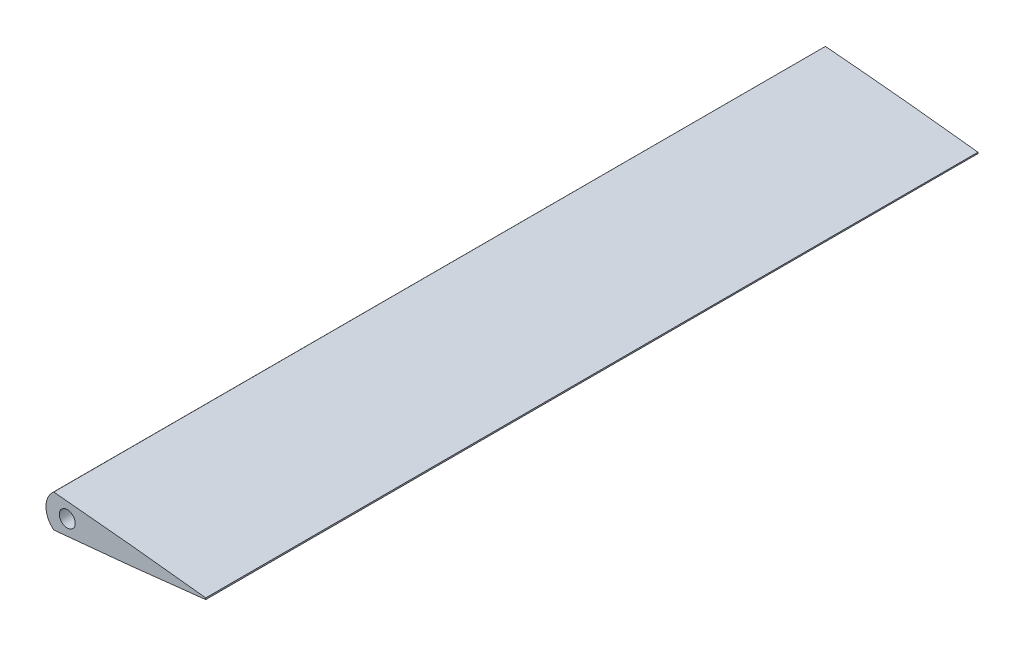
ISO-10303-21;
HEADER;
FILE_DESCRIPTION(('STEP AP214'),'2;1');
FILE_NAME('part.step','',(''),(''),'','','');
FILE_SCHEMA(('AUTOMOTIVE_DESIGN { 1 0 10303 214 1 1 1 1 }'));
ENDSEC;
DATA;
#1=APPLICATION_CONTEXT('core data for automotive mechanical design processes');
#2=APPLICATION_PROTOCOL_DEFINITION('international standard','automotive_design',2000,#1);
#3=PRODUCT_CONTEXT('',#1,'mechanical');
#4=PRODUCT('Part','Part','',(#3));
#5=PRODUCT_RELATED_PRODUCT_CATEGORY('part','',(#4));
#6=PRODUCT_DEFINITION_FORMATION('','',#4);
#7=PRODUCT_DEFINITION_CONTEXT('part definition',#1,'design');
#8=PRODUCT_DEFINITION('design','',#6,#7);
#9=PRODUCT_DEFINITION_SHAPE('','',#8);
#10=(LENGTH_UNIT() NAMED_UNIT(*) SI_UNIT(.MILLI.,.METRE.));
#11=(NAMED_UNIT(*) PLANE_ANGLE_UNIT() SI_UNIT($,.RADIAN.));
#12=(NAMED_UNIT(*) SI_UNIT($,.STERADIAN.) SOLID_ANGLE_UNIT());
#13=UNCERTAINTY_MEASURE_WITH_UNIT(LENGTH_MEASURE(1.E-05),#10,'distance_accuracy_value','');
#14=(GEOMETRIC_REPRESENTATION_CONTEXT(3) GLOBAL_UNCERTAINTY_ASSIGNED_CONTEXT((#13)) GLOBAL_UNIT_ASSIGNED_CONTEXT((#10,
#11,#12)) REPRESENTATION_CONTEXT('',''));
#15=CARTESIAN_POINT('',(0.,0.,0.));
#16=DIRECTION('',(0.,0.,1.));
#17=DIRECTION('',(1.,0.,0.));
#18=AXIS2_PLACEMENT_3D('',#15,#16,#17);
#19=CARTESIAN_POINT('',(70.,0.0735,0.));
#20=CARTESIAN_POINT('',(70.,0.05775,-90.));
#21=CARTESIAN_POINT('',(68.8335080399569,0.207369644620947,0.));
#22=CARTESIAN_POINT('',(69.0834706028233,0.162933292202173,-90.));
#23=CARTESIAN_POINT('',(66.5013366610328,0.475015684530368,0.));
#24=CARTESIAN_POINT('',(67.2510502336686,0.373226609273861,-90.));
#25=CARTESIAN_POINT('',(59.5068534375464,1.22059950301267,0.));
#26=CARTESIAN_POINT('',(61.7553848437865,0.959042466652812,-90.));
#27=CARTESIAN_POINT('',(51.3411291423464,1.97323482674955,0.));
#28=CARTESIAN_POINT('',(55.3394586118436,1.55039879244607,-90.));
#29=CARTESIAN_POINT('',(42.0033550763474,2.6781420115594,0.));
#30=CARTESIAN_POINT('',(48.0026361314158,2.10425443765382,-90.));
#31=CARTESIAN_POINT('',(35.0033276822841,3.10894088739879,0.));
#32=CARTESIAN_POINT('',(42.5026146075089,2.44273926867048,-90.));
#33=CARTESIAN_POINT('',(28.0028425035665,3.41546324526182,0.));
#34=CARTESIAN_POINT('',(37.0022333956594,2.68357826413429,-90.));
#35=CARTESIAN_POINT('',(20.9996176811236,3.54412790887703,0.));
#36=CARTESIAN_POINT('',(31.4996996065971,2.78467192840338,-90.));
#37=CARTESIAN_POINT('',(15.1621219043051,3.43896686269696,0.));
#38=CARTESIAN_POINT('',(26.913095781954,2.70204539211904,-90.));
#39=CARTESIAN_POINT('',(10.4932470006794,3.14283251784594,0.));
#40=CARTESIAN_POINT('',(23.2446940719624,2.46936840687895,-90.));
#41=CARTESIAN_POINT('',(7.57533938887657,2.83324720582861,0.));
#42=CARTESIAN_POINT('',(20.9520523769744,2.22612280457962,-90.));
#43=CARTESIAN_POINT('',(5.24030650692798,2.46209864989354,0.));
#44=CARTESIAN_POINT('',(19.1173836840148,1.93450608205921,-90.));
#45=CARTESIAN_POINT('',(3.48530508189471,2.09967851116287,0.));
#46=CARTESIAN_POINT('',(17.7384539929173,1.64974740162797,-90.));
#47=CARTESIAN_POINT('',(1.99314144537641,1.63920813156458,0.));
#48=CARTESIAN_POINT('',(16.5660397070815,1.28794924622931,-90.));
#49=CARTESIAN_POINT('',(0.755632776345661,1.11827318057108,0.));
#50=CARTESIAN_POINT('',(15.5937114671287,0.878643213305847,-90.));
#51=CARTESIAN_POINT('',(-0.447448608869755,0.,0.));
#52=CARTESIAN_POINT('',(14.648433235888,0.,-90.));
#53=CARTESIAN_POINT('',(0.755632776345677,-1.11827318057109,0.));
#54=CARTESIAN_POINT('',(15.5937114671287,-0.878643213305856,-90.));
#55=CARTESIAN_POINT('',(1.99314144537639,-1.63920813156457,0.));
#56=CARTESIAN_POINT('',(16.5660397070814,-1.2879492462293,-90.));
#57=CARTESIAN_POINT('',(3.48530508189473,-2.09967851116288,0.));
#58=CARTESIAN_POINT('',(17.7384539929173,-1.64974740162797,-90.));
#59=CARTESIAN_POINT('',(5.24030650692796,-2.46209864989353,0.));
#60=CARTESIAN_POINT('',(19.1173836840148,-1.93450608205921,-90.));
#61=CARTESIAN_POINT('',(7.57533938887658,-2.83324720582861,0.));
#62=CARTESIAN_POINT('',(20.9520523769745,-2.22612280457962,-90.));
#63=CARTESIAN_POINT('',(10.4932470006794,-3.14283251784594,0.));
#64=CARTESIAN_POINT('',(23.2446940719624,-2.46936840687895,-90.));
#65=CARTESIAN_POINT('',(15.1621219043051,-3.43896686269696,0.));
#66=CARTESIAN_POINT('',(26.913095781954,-2.70204539211904,-90.));
#67=CARTESIAN_POINT('',(20.9996176811236,-3.54412790887703,0.));
#68=CARTESIAN_POINT('',(31.4996996065971,-2.78467192840338,-90.));
#69=CARTESIAN_POINT('',(28.0028425035665,-3.41546324526182,0.));
#70=CARTESIAN_POINT('',(37.0022333956594,-2.68357826413429,-90.));
#71=CARTESIAN_POINT('',(35.0033276822841,-3.10894088739879,0.));
#72=CARTESIAN_POINT('',(42.5026146075089,-2.44273926867048,-90.));
#73=CARTESIAN_POINT('',(42.0033550763474,-2.6781420115594,0.));
#74=CARTESIAN_POINT('',(48.0026361314158,-2.10425443765382,-90.));
#75=CARTESIAN_POINT('',(51.3411291423464,-1.97323482674955,0.));
#76=CARTESIAN_POINT('',(55.3394586118436,-1.55039879244607,-90.));
#77=CARTESIAN_POINT('',(59.5068534375464,-1.22059950301267,0.));
#78=CARTESIAN_POINT('',(61.7553848437864,-0.959042466652813,-90.));
#79=CARTESIAN_POINT('',(66.5013366610328,-0.475015684530368,0.));
#80=CARTESIAN_POINT('',(67.2510502336687,-0.37322660927386,-90.));
#81=CARTESIAN_POINT('',(68.8335080399569,-0.207369644620947,0.));
#82=CARTESIAN_POINT('',(69.0834706028233,-0.162933292202173,-90.));
#83=CARTESIAN_POINT('',(70.,-0.0735,0.));
#84=CARTESIAN_POINT('',(70.,-0.05775,-90.));
#85=B_SPLINE_SURFACE_WITH_KNOTS('',3,1,((#19,#20),(#21,#22),(#23,#24),(#25,#26),(#27,#28),(#29,
#30),(#31,#32),(#33,#34),(#35,#36),(#37,#38),(#39,#40),(#41,#42),(#43,#44),(#45,#46),(#47,#48),
(#49,#50),(#51,#52),(#53,#54),(#55,#56),(#57,#58),(#59,#60),(#61,#62),(#63,#64),(#65,#66),(#67,
#68),(#69,#70),(#71,#72),(#73,#74),(#75,#76),(#77,#78),(#79,#80),(#81,#82),(#83,#84)),
.UNSPECIFIED.,.F.,.F.,.F.,(4,1,1,1,1,1,1,1,1,1,1,1,1,1,1,1,1,1,1,1,1,1,1,1,1,1,1,1,1,1,4),(2,2),
(0.,0.0248235560251693,0.0496298207515118,0.148712652883516,0.198182139774084,0.247604472837194,
0.296979942928689,0.34631759583347,0.395664019787251,0.420382181676291,0.445198050680487,
0.457689209223658,0.470304282792856,0.483229229601925,0.4900691736526,0.5,0.5099308263474,
0.516770770398075,0.529695717207144,0.542310790776342,0.554801949319513,0.579617818323709,
0.604335980212749,0.65368240416653,0.703020057071311,0.752395527162806,0.801817860225916,
0.851287347116484,0.950370179248488,0.975176443974831,1.),(0.,1.),.UNSPECIFIED.);
#86=CARTESIAN_POINT('',(70.,0.0704375,-17.5));
#87=CARTESIAN_POINT('',(69.7414668779824,0.100106949896239,-17.5));
#88=CARTESIAN_POINT('',(69.4829337921183,0.129777118919202,-17.5));
#89=CARTESIAN_POINT('',(68.9658544651581,0.189005899479906,-17.5));
#90=CARTESIAN_POINT('',(68.7073082240433,0.218564510853554,-17.5));
#91=CARTESIAN_POINT('',(68.1901882358893,0.277457306950232,-17.5));
#92=CARTESIAN_POINT('',(67.9316144886635,0.306791490036966,-17.5));
#93=CARTESIAN_POINT('',(67.4144299873231,0.365130673882984,-17.5));
#94=CARTESIAN_POINT('',(67.1558192332321,0.3941356748506,-17.5));
#95=CARTESIAN_POINT('',(66.4168039808516,0.476344441079446,-17.5));
#96=CARTESIAN_POINT('',(65.9363355626864,0.528974992491431,-17.5));
#97=CARTESIAN_POINT('',(64.9752343472049,0.632715956153438,-17.5));
#98=CARTESIAN_POINT('',(64.494601549673,0.683826366402973,-17.5));
#99=CARTESIAN_POINT('',(63.5332009263706,0.784783191340418,-17.5));
#100=CARTESIAN_POINT('',(63.0524330999367,0.834629599705253,-17.5));
#101=CARTESIAN_POINT('',(62.0907783018258,0.933156407462658,-17.5));
#102=CARTESIAN_POINT('',(61.6098913302001,0.981836807356616,-17.5));
#103=CARTESIAN_POINT('',(60.1670563707481,1.12610930993913,-17.5));
#104=CARTESIAN_POINT('',(59.2049310287071,1.21993306286322,-17.5));
#105=CARTESIAN_POINT('',(57.2802402048466,1.40290932818104,-17.5));
#106=CARTESIAN_POINT('',(56.3176747249078,1.49206186035103,-17.5));
#107=CARTESIAN_POINT('',(55.2366038504029,1.5895615724776,-17.5));
#108=CARTESIAN_POINT('',(55.1183034836896,1.60019551925266,-17.5));
#109=CARTESIAN_POINT('',(55.,1.6107944379007,-17.5));
#110=B_SPLINE_CURVE_WITH_KNOTS('',3,(#86,#87,#88,#89,#90,#91,#92,#93,#94,#95,#96,#97,#98,#99,
#100,#101,#102,#103,#104,#105,#106,#107,#108,#109),.UNSPECIFIED.,.F.,.F.,(4,2,2,2,2,2,2,2,2,2,2,
4),(0.,0.780690069571208,1.56138128703616,2.34207819107562,3.12277460100202,4.57279884031261,
6.02282498775331,7.47285838741103,8.92289116353951,11.8229467324595,14.7229900226021,
15.0793220328914),.UNSPECIFIED.);
#111=CARTESIAN_POINT('',(70.,0.0704375,-17.5));
#112=VERTEX_POINT('',#111);
#113=CARTESIAN_POINT('',(55.7299128466162,1.54495262801463,-17.5));
#114=VERTEX_POINT('',#113);
#115=EDGE_CURVE('E99',#112,#114,#110,.T.);
#116=DIRECTION('',(0.,-0.000174999997320312,-0.9999999846875));
#117=VECTOR('',#116,1.);
#118=CARTESIAN_POINT('',(70.,0.065625,-45.));
#119=LINE('',#118,#117);
#120=CARTESIAN_POINT('',(70.,0.0577500000000001,-90.));
#121=VERTEX_POINT('',#120);
#122=EDGE_CURVE('E268',#112,#121,#119,.T.);
#123=CARTESIAN_POINT('',(70.,0.05775,-90.));
#124=CARTESIAN_POINT('',(69.0834706028233,0.162933292202173,-90.));
#125=CARTESIAN_POINT('',(67.2510502336686,0.373226609273861,-90.));
#126=CARTESIAN_POINT('',(61.7553848437865,0.959042466652812,-90.));
#127=CARTESIAN_POINT('',(55.3394586118436,1.55039879244607,-90.));
#128=CARTESIAN_POINT('',(48.0026361314158,2.10425443765382,-90.));
#129=CARTESIAN_POINT('',(42.5026146075089,2.44273926867048,-90.));
#130=CARTESIAN_POINT('',(37.0022333956594,2.68357826413429,-90.));
#131=CARTESIAN_POINT('',(31.4996996065971,2.78467192840338,-90.));
#132=CARTESIAN_POINT('',(26.913095781954,2.70204539211904,-90.));
#133=CARTESIAN_POINT('',(23.2446940719624,2.46936840687895,-90.));
#134=CARTESIAN_POINT('',(20.9520523769744,2.22612280457962,-90.));
#135=CARTESIAN_POINT('',(19.1173836840148,1.93450608205921,-90.));
#136=CARTESIAN_POINT('',(17.7384539929173,1.64974740162797,-90.));
#137=CARTESIAN_POINT('',(16.5660397070815,1.28794924622931,-90.));
#138=CARTESIAN_POINT('',(15.5937114671287,0.878643213305847,-90.));
#139=CARTESIAN_POINT('',(14.648433235888,0.,-90.));
#140=CARTESIAN_POINT('',(15.5937114671287,-0.878643213305856,-90.));
#141=CARTESIAN_POINT('',(16.5660397070814,-1.2879492462293,-90.));
#142=CARTESIAN_POINT('',(17.7384539929173,-1.64974740162797,-90.));
#143=CARTESIAN_POINT('',(19.1173836840148,-1.93450608205921,-90.));
#144=CARTESIAN_POINT('',(20.9520523769745,-2.22612280457962,-90.));
#145=CARTESIAN_POINT('',(23.2446940719624,-2.46936840687895,-90.));
#146=CARTESIAN_POINT('',(26.913095781954,-2.70204539211904,-90.));
#147=CARTESIAN_POINT('',(31.4996996065971,-2.78467192840338,-90.));
#148=CARTESIAN_POINT('',(37.0022333956594,-2.68357826413429,-90.));
#149=CARTESIAN_POINT('',(42.5026146075089,-2.44273926867048,-90.));
#150=CARTESIAN_POINT('',(48.0026361314158,-2.10425443765382,-90.));
#151=CARTESIAN_POINT('',(55.3394586118436,-1.55039879244607,-90.));
#152=CARTESIAN_POINT('',(61.7553848437864,-0.959042466652813,-90.));
#153=CARTESIAN_POINT('',(67.2510502336687,-0.37322660927386,-90.));
#154=CARTESIAN_POINT('',(69.0834706028233,-0.162933292202173,-90.));
#155=CARTESIAN_POINT('',(70.,-0.05775,-90.));
#156=B_SPLINE_CURVE_WITH_KNOTS('',3,(#123,#124,#125,#126,#127,#128,#129,#130,#131,#132,#133,
#134,#135,#136,#137,#138,#139,#140,#141,#142,#143,#144,#145,#146,#147,#148,#149,#150,#151,#152,
#153,#154,#155),.UNSPECIFIED.,.F.,.F.,(4,1,1,1,1,1,1,1,1,1,1,1,1,1,1,1,1,1,1,1,1,1,1,1,1,1,1,1,
1,1,4),(0.,0.0248235560251693,0.0496298207515118,0.148712652883516,0.198182139774084,
0.247604472837194,0.296979942928689,0.34631759583347,0.395664019787251,0.420382181676291,
0.445198050680487,0.457689209223658,0.470304282792856,0.483229229601925,0.4900691736526,0.5,
0.5099308263474,0.516770770398075,0.529695717207144,0.542310790776342,0.554801949319513,
0.579617818323709,0.604335980212749,0.65368240416653,0.703020057071311,0.752395527162806,
0.801817860225916,0.851287347116484,0.950370179248488,0.975176443974831,1.),.UNSPECIFIED.);
#157=CARTESIAN_POINT('',(55.674911850337,1.49804585898522,-90.));
#158=VERTEX_POINT('',#157);
#159=EDGE_CURVE('E271',#121,#158,#156,.T.);
#160=CARTESIAN_POINT('',(55.7299128466161,1.54495262801455,-17.5));
#161=CARTESIAN_POINT('',(55.7292076001844,1.54437285208487,-18.5409232678505));
#162=CARTESIAN_POINT('',(55.728499327807,1.54378978121006,-19.5818465318398));
#163=CARTESIAN_POINT('',(55.7249424860675,1.54085753517065,-24.7864628324153));
#164=CARTESIAN_POINT('',(55.7220474771504,1.5384576850111,-28.9501558089452));
#165=CARTESIAN_POINT('',(55.713200399108,1.53107996407553,-41.4412345246901));
#166=CARTESIAN_POINT('',(55.7070862786955,1.52592392284566,-49.7686200443526));
#167=CARTESIAN_POINT('',(55.6925752374118,1.51352429525124,-68.7299887066044));
#168=CARTESIAN_POINT('',(55.6840150995807,1.50609806871139,-79.3639716101941));
#169=CARTESIAN_POINT('',(55.6749130180213,1.49804689185324,-89.9986357121884));
#170=CARTESIAN_POINT('',(55.6749124341803,1.49804637542052,-89.9993178560942));
#171=CARTESIAN_POINT('',(55.674911850337,1.49804585898522,-90.));
#172=B_SPLINE_CURVE_WITH_KNOTS('',3,(#160,#161,#162,#163,#164,#165,#166,#167,#168,#169,#170,
#171),.UNSPECIFIED.,.F.,.F.,(4,2,2,2,2,4),(0.,3.12277100471986,15.6138550255425,40.596023084312,
72.4979897857242,72.5000362187775),.UNSPECIFIED.);
#173=EDGE_CURVE('E86',#114,#158,#172,.T.);
#174=ORIENTED_EDGE('',*,*,#115,.F.);
#175=ORIENTED_EDGE('',*,*,#122,.T.);
#176=ORIENTED_EDGE('',*,*,#159,.T.);
#177=ORIENTED_EDGE('',*,*,#173,.F.);
#178=EDGE_LOOP('',(#174,#175,#176,#177));
#179=FACE_BOUND('',#178,.T.);
#180=ADVANCED_FACE('F39',(#179),#85,.F.);
#181=CARTESIAN_POINT('',(70.,0.05775,-90.));
#182=CARTESIAN_POINT('',(69.0834706028233,0.162933292202173,-90.));
#183=CARTESIAN_POINT('',(67.2510502336686,0.373226609273861,-90.));
#184=CARTESIAN_POINT('',(61.7553848437865,0.959042466652812,-90.));
#185=CARTESIAN_POINT('',(55.3394586118436,1.55039879244607,-90.));
#186=CARTESIAN_POINT('',(48.0026361314158,2.10425443765382,-90.));
#187=CARTESIAN_POINT('',(42.5026146075089,2.44273926867048,-90.));
#188=CARTESIAN_POINT('',(37.0022333956594,2.68357826413429,-90.));
#189=CARTESIAN_POINT('',(31.4996996065971,2.78467192840338,-90.));
#190=CARTESIAN_POINT('',(26.913095781954,2.70204539211904,-90.));
#191=CARTESIAN_POINT('',(23.2446940719624,2.46936840687895,-90.));
#192=CARTESIAN_POINT('',(20.9520523769744,2.22612280457962,-90.));
#193=CARTESIAN_POINT('',(19.1173836840148,1.93450608205921,-90.));
#194=CARTESIAN_POINT('',(17.7384539929173,1.64974740162797,-90.));
#195=CARTESIAN_POINT('',(16.5660397070815,1.28794924622931,-90.));
#196=CARTESIAN_POINT('',(15.5937114671287,0.878643213305847,-90.));
#197=CARTESIAN_POINT('',(14.648433235888,0.,-90.));
#198=CARTESIAN_POINT('',(15.5937114671287,-0.878643213305856,-90.));
#199=CARTESIAN_POINT('',(16.5660397070814,-1.2879492462293,-90.));
#200=CARTESIAN_POINT('',(17.7384539929173,-1.64974740162797,-90.));
#201=CARTESIAN_POINT('',(19.1173836840148,-1.93450608205921,-90.));
#202=CARTESIAN_POINT('',(20.9520523769745,-2.22612280457962,-90.));
#203=CARTESIAN_POINT('',(23.2446940719624,-2.46936840687895,-90.));
#204=CARTESIAN_POINT('',(26.913095781954,-2.70204539211904,-90.));
#205=CARTESIAN_POINT('',(31.4996996065971,-2.78467192840338,-90.));
#206=CARTESIAN_POINT('',(37.0022333956594,-2.68357826413429,-90.));
#207=CARTESIAN_POINT('',(42.5026146075089,-2.44273926867048,-90.));
#208=CARTESIAN_POINT('',(48.0026361314158,-2.10425443765382,-90.));
#209=CARTESIAN_POINT('',(55.3394586118436,-1.55039879244607,-90.));
#210=CARTESIAN_POINT('',(61.7553848437864,-0.959042466652813,-90.));
#211=CARTESIAN_POINT('',(67.2510502336687,-0.37322660927386,-90.));
#212=CARTESIAN_POINT('',(69.0834706028233,-0.162933292202173,-90.));
#213=CARTESIAN_POINT('',(70.,-0.05775,-90.));
#214=B_SPLINE_CURVE_WITH_KNOTS('',3,(#181,#182,#183,#184,#185,#186,#187,#188,#189,#190,#191,
#192,#193,#194,#195,#196,#197,#198,#199,#200,#201,#202,#203,#204,#205,#206,#207,#208,#209,#210,
#211,#212,#213),.UNSPECIFIED.,.F.,.F.,(4,1,1,1,1,1,1,1,1,1,1,1,1,1,1,1,1,1,1,1,1,1,1,1,1,1,1,1,
1,1,4),(0.,0.0248235560251693,0.0496298207515118,0.148712652883516,0.198182139774084,
0.247604472837194,0.296979942928689,0.34631759583347,0.395664019787251,0.420382181676291,
0.445198050680487,0.457689209223658,0.470304282792856,0.483229229601925,0.4900691736526,0.5,
0.5099308263474,0.516770770398075,0.529695717207144,0.542310790776342,0.554801949319513,
0.579617818323709,0.604335980212749,0.65368240416653,0.703020057071311,0.752395527162806,
0.801817860225916,0.851287347116484,0.950370179248488,0.975176443974831,1.),.UNSPECIFIED.);
#215=CARTESIAN_POINT('',(70.,-0.0577500000000001,-90.));
#216=VERTEX_POINT('',#215);
#217=CARTESIAN_POINT('',(55.674911850337,-1.49804585898522,-90.));
#218=VERTEX_POINT('',#217);
#219=EDGE_CURVE('E94',#216,#218,#214,.F.);
#220=DIRECTION('',(0.,0.000174999997320312,-0.9999999846875));
#221=VECTOR('',#220,1.);
#222=CARTESIAN_POINT('',(70.,-0.065625,-45.));
#223=LINE('',#222,#221);
#224=CARTESIAN_POINT('',(70.,-0.0704375,-17.5));
#225=VERTEX_POINT('',#224);
#226=EDGE_CURVE('E267',#225,#216,#223,.T.);
#227=CARTESIAN_POINT('',(55.,-1.6107944379007,-17.5));
#228=CARTESIAN_POINT('',(55.5183924773578,-1.56435100588624,-17.5));
#229=CARTESIAN_POINT('',(56.0367247671315,-1.51723546076364,-17.5));
#230=CARTESIAN_POINT('',(57.07325571094,-1.42165572140086,-17.5));
#231=CARTESIAN_POINT('',(57.5914543671824,-1.37319155110175,-17.5));
#232=CARTESIAN_POINT('',(58.605535087078,-1.27701288064262,-17.5));
#233=CARTESIAN_POINT('',(59.1014225357748,-1.22935515154006,-17.5));
#234=CARTESIAN_POINT('',(60.0930766492884,-1.13279581211134,-17.5));
#235=CARTESIAN_POINT('',(60.5888433140275,-1.08389420098766,-17.5));
#236=CARTESIAN_POINT('',(61.580251814176,-0.984836506136815,-17.5));
#237=CARTESIAN_POINT('',(62.0758936494551,-0.934680421107013,-17.5));
#238=CARTESIAN_POINT('',(63.0670504176442,-0.833132978354628,-17.5));
#239=CARTESIAN_POINT('',(63.5625653506397,-0.781741621467571,-17.5));
#240=CARTESIAN_POINT('',(64.5534861774625,-0.677597789115176,-17.5));
#241=CARTESIAN_POINT('',(65.0488920617085,-0.624845222290212,-17.5));
#242=CARTESIAN_POINT('',(65.7918713913089,-0.54451705246844,-17.5));
#243=CARTESIAN_POINT('',(66.0395097294562,-0.517541093179054,-17.5));
#244=CARTESIAN_POINT('',(66.5347381649614,-0.463149945752336,-17.5));
#245=CARTESIAN_POINT('',(66.7823282623273,-0.435734757688022,-17.5));
#246=CARTESIAN_POINT('',(67.5250324576231,-0.35289255001225,-17.5));
#247=CARTESIAN_POINT('',(68.0200798203222,-0.296868956053062,-17.5));
#248=CARTESIAN_POINT('',(69.0100848098036,-0.184038659458192,-17.5));
#249=CARTESIAN_POINT('',(69.5050424367104,-0.127231957917589,-17.5));
#250=CARTESIAN_POINT('',(70.,-0.0704375,-17.5));
#251=B_SPLINE_CURVE_WITH_KNOTS('',3,(#227,#228,#229,#230,#231,#232,#233,#234,#235,#236,#237,
#238,#239,#240,#241,#242,#243,#244,#245,#246,#247,#248,#249,#250),.UNSPECIFIED.,.F.,.F.,(4,2,2,
2,2,2,2,2,2,2,2,4),(0.,1.56140595532902,3.12278420990647,4.61729950187834,6.11181575210937,
7.60633355430464,9.10085034565005,10.5954677059592,11.3427772579192,12.090086685649,
13.5847074675807,15.0793261596803),.UNSPECIFIED.);
#252=CARTESIAN_POINT('',(55.7299128466161,-1.54495262801456,-17.5));
#253=VERTEX_POINT('',#252);
#254=EDGE_CURVE('E95',#253,#225,#251,.T.);
#255=CARTESIAN_POINT('',(55.674911850337,-1.49804585898522,-90.));
#256=CARTESIAN_POINT('',(55.6758027739737,-1.49883392162366,-88.9590770113374));
#257=CARTESIAN_POINT('',(55.6766884725097,-1.49961594560514,-87.9181540136105));
#258=CARTESIAN_POINT('',(55.6810914816451,-1.5034967060943,-82.7135389797662));
#259=CARTESIAN_POINT('',(55.6845323416069,-1.50650736434355,-78.5498468128421));
#260=CARTESIAN_POINT('',(55.6946349306293,-1.51528950909782,-66.0587699524832));
#261=CARTESIAN_POINT('',(55.7010766688208,-1.52081116560385,-57.7313849064818));
#262=CARTESIAN_POINT('',(55.7151864063618,-1.53276169088771,-38.7693335072415));
#263=CARTESIAN_POINT('',(55.7226996445648,-1.53901803255006,-28.134666928311));
#264=CARTESIAN_POINT('',(55.7299128466161,-1.54495262801455,-17.5));
#265=B_SPLINE_CURVE_WITH_KNOTS('',3,(#255,#256,#257,#258,#259,#260,#261,#262,#263,#264),
.UNSPECIFIED.,.F.,.F.,(4,2,2,2,4),(0.,3.12277100478067,15.613855028726,40.5960230976778,
72.5000362274556),.UNSPECIFIED.);
#266=EDGE_CURVE('E83',#218,#253,#265,.T.);
#267=ORIENTED_EDGE('',*,*,#219,.F.);
#268=ORIENTED_EDGE('',*,*,#226,.F.);
#269=ORIENTED_EDGE('',*,*,#254,.F.);
#270=ORIENTED_EDGE('',*,*,#266,.F.);
#271=EDGE_LOOP('',(#267,#268,#269,#270));
#272=FACE_BOUND('',#271,.T.);
#273=ADVANCED_FACE('F92',(#272),#85,.F.);
#274=CARTESIAN_POINT('',(55.,-4.68748352412842,-90.));
#275=DIRECTION('',(0.,0.,-1.));
#276=DIRECTION('',(1.,0.,0.));
#277=AXIS2_PLACEMENT_3D('',#274,#275,#276);
#278=PLANE('',#277);
#279=CARTESIAN_POINT('',(57.,0.,-90.));
#280=DIRECTION('',(0.,0.,1.));
#281=DIRECTION('',(1.,0.,0.));
#282=AXIS2_PLACEMENT_3D('',#279,#280,#281);
#283=CIRCLE('',#282,0.749999999999999);
#284=CARTESIAN_POINT('',(57.75,0.,-90.));
#285=VERTEX_POINT('',#284);
#286=EDGE_CURVE('E168',#285,#285,#283,.T.);
#287=ORIENTED_EDGE('',*,*,#286,.T.);
#288=EDGE_LOOP('',(#287));
#289=FACE_BOUND('',#288,.T.);
#290=ORIENTED_EDGE('',*,*,#159,.F.);
#291=DIRECTION('',(0.,1.,0.));
#292=VECTOR('',#291,1.);
#293=CARTESIAN_POINT('',(70.,-3.54412790887703,-90.));
#294=LINE('',#293,#292);
#295=EDGE_CURVE('E54',#216,#121,#294,.T.);
#296=ORIENTED_EDGE('',*,*,#295,.F.);
#297=ORIENTED_EDGE('',*,*,#219,.T.);
#298=CARTESIAN_POINT('',(57.,0.,-90.));
#299=DIRECTION('',(0.,0.,-1.));
#300=DIRECTION('',(1.,0.,0.));
#301=AXIS2_PLACEMENT_3D('',#298,#299,#300);
#302=CIRCLE('',#301,2.);
#303=EDGE_CURVE('E80',#218,#158,#302,.T.);
#304=ORIENTED_EDGE('',*,*,#303,.T.);
#305=EDGE_LOOP('',(#290,#296,#297,#304));
#306=FACE_BOUND('',#305,.T.);
#307=ADVANCED_FACE('F97',(#289,#306),#278,.T.);
#308=CARTESIAN_POINT('',(55.,-4.68748352412842,-17.5));
#309=DIRECTION('',(0.,0.,1.));
#310=DIRECTION('',(-1.,0.,0.));
#311=AXIS2_PLACEMENT_3D('',#308,#309,#310);
#312=PLANE('',#311);
#313=CARTESIAN_POINT('',(57.,0.,-17.5));
#314=DIRECTION('',(0.,0.,-1.));
#315=DIRECTION('',(-1.,0.,0.));
#316=AXIS2_PLACEMENT_3D('',#313,#314,#315);
#317=CIRCLE('',#316,0.749999999999999);
#318=CARTESIAN_POINT('',(56.25,0.,-17.5));
#319=VERTEX_POINT('',#318);
#320=EDGE_CURVE('E169',#319,#319,#317,.T.);
#321=ORIENTED_EDGE('',*,*,#320,.T.);
#322=EDGE_LOOP('',(#321));
#323=FACE_BOUND('',#322,.T.);
#324=CARTESIAN_POINT('',(57.,0.,-17.5));
#325=DIRECTION('',(0.,0.,-1.));
#326=DIRECTION('',(-1.,0.,0.));
#327=AXIS2_PLACEMENT_3D('',#324,#325,#326);
#328=CIRCLE('',#327,2.);
#329=EDGE_CURVE('E11',#253,#114,#328,.T.);
#330=ORIENTED_EDGE('',*,*,#329,.F.);
#331=ORIENTED_EDGE('',*,*,#254,.T.);
#332=DIRECTION('',(0.,1.,0.));
#333=VECTOR('',#332,1.);
#334=CARTESIAN_POINT('',(70.,-0.0735,-17.5));
#335=LINE('',#334,#333);
#336=EDGE_CURVE('E47',#225,#112,#335,.T.);
#337=ORIENTED_EDGE('',*,*,#336,.T.);
#338=ORIENTED_EDGE('',*,*,#115,.T.);
#339=EDGE_LOOP('',(#330,#331,#337,#338));
#340=FACE_BOUND('',#339,.T.);
#341=ADVANCED_FACE('F123',(#323,#340),#312,.T.);
#342=CARTESIAN_POINT('',(70.,-0.0735,0.));
#343=DIRECTION('',(1.,0.,0.));
#344=DIRECTION('',(0.,1.,0.));
#345=AXIS2_PLACEMENT_3D('',#342,#343,#344);
#346=PLANE('',#345);
#347=ORIENTED_EDGE('',*,*,#226,.T.);
#348=ORIENTED_EDGE('',*,*,#295,.T.);
#349=ORIENTED_EDGE('',*,*,#122,.F.);
#350=ORIENTED_EDGE('',*,*,#336,.F.);
#351=EDGE_LOOP('',(#347,#348,#349,#350));
#352=FACE_BOUND('',#351,.T.);
#353=ADVANCED_FACE('F41',(#352),#346,.T.);
#354=CARTESIAN_POINT('',(57.,0.,-90.));
#355=DIRECTION('',(0.,0.,1.));
#356=DIRECTION('',(-1.,0.,0.));
#357=AXIS2_PLACEMENT_3D('',#354,#355,#356);
#358=CYLINDRICAL_SURFACE('',#357,2.);
#359=ORIENTED_EDGE('',*,*,#266,.T.);
#360=ORIENTED_EDGE('',*,*,#329,.T.);
#361=ORIENTED_EDGE('',*,*,#173,.T.);
#362=ORIENTED_EDGE('',*,*,#303,.F.);
#363=EDGE_LOOP('',(#359,#360,#361,#362));
#364=FACE_BOUND('',#363,.T.);
#365=ADVANCED_FACE('F82',(#364),#358,.T.);
#366=CARTESIAN_POINT('',(57.,0.,-80.));
#367=DIRECTION('',(0.,0.,-1.));
#368=DIRECTION('',(1.,0.,0.));
#369=AXIS2_PLACEMENT_3D('',#366,#367,#368);
#370=CYLINDRICAL_SURFACE('',#369,0.749999999999999);
#371=CARTESIAN_POINT('',(57.,0.,-80.));
#372=DIRECTION('',(0.,0.,1.));
#373=DIRECTION('',(1.,0.,0.));
#374=AXIS2_PLACEMENT_3D('',#371,#372,#373);
#375=CIRCLE('',#374,0.749999999999999);
#376=CARTESIAN_POINT('',(57.75,0.,-80.));
#377=VERTEX_POINT('',#376);
#378=EDGE_CURVE('E88',#377,#377,#375,.T.);
#379=ORIENTED_EDGE('',*,*,#378,.T.);
#380=EDGE_LOOP('',(#379));
#381=FACE_BOUND('',#380,.T.);
#382=ORIENTED_EDGE('',*,*,#286,.F.);
#383=EDGE_LOOP('',(#382));
#384=FACE_BOUND('',#383,.T.);
#385=ADVANCED_FACE('F147',(#381,#384),#370,.F.);
#386=CARTESIAN_POINT('',(57.,0.,-80.));
#387=DIRECTION('',(0.,0.,-1.));
#388=DIRECTION('',(1.,0.,0.));
#389=AXIS2_PLACEMENT_3D('',#386,#387,#388);
#390=PLANE('',#389);
#391=ORIENTED_EDGE('',*,*,#378,.F.);
#392=EDGE_LOOP('',(#391));
#393=FACE_BOUND('',#392,.T.);
#394=ADVANCED_FACE('F151',(#393),#390,.T.);
#395=CARTESIAN_POINT('',(57.,0.,-27.5));
#396=DIRECTION('',(0.,0.,1.));
#397=DIRECTION('',(-1.,0.,0.));
#398=AXIS2_PLACEMENT_3D('',#395,#396,#397);
#399=CYLINDRICAL_SURFACE('',#398,0.749999999999999);
#400=CARTESIAN_POINT('',(57.,0.,-27.5));
#401=DIRECTION('',(0.,0.,-1.));
#402=DIRECTION('',(-1.,0.,0.));
#403=AXIS2_PLACEMENT_3D('',#400,#401,#402);
#404=CIRCLE('',#403,0.749999999999999);
#405=CARTESIAN_POINT('',(56.25,0.,-27.5));
#406=VERTEX_POINT('',#405);
#407=EDGE_CURVE('E167',#406,#406,#404,.T.);
#408=ORIENTED_EDGE('',*,*,#407,.T.);
#409=EDGE_LOOP('',(#408));
#410=FACE_BOUND('',#409,.T.);
#411=ORIENTED_EDGE('',*,*,#320,.F.);
#412=EDGE_LOOP('',(#411));
#413=FACE_BOUND('',#412,.T.);
#414=ADVANCED_FACE('F155',(#410,#413),#399,.F.);
#415=CARTESIAN_POINT('',(57.,0.,-27.5));
#416=DIRECTION('',(0.,0.,1.));
#417=DIRECTION('',(-1.,0.,0.));
#418=AXIS2_PLACEMENT_3D('',#415,#416,#417);
#419=PLANE('',#418);
#420=ORIENTED_EDGE('',*,*,#407,.F.);
#421=EDGE_LOOP('',(#420));
#422=FACE_BOUND('',#421,.T.);
#423=ADVANCED_FACE('F159',(#422),#419,.T.);
#424=CLOSED_SHELL('',(#180,#273,#307,#341,#353,#365,#385,#394,#414,#423));
#425=MANIFOLD_SOLID_BREP('B2',#424);
#426=ADVANCED_BREP_SHAPE_REPRESENTATION('',(#18,#425),#14);
#427=SHAPE_DEFINITION_REPRESENTATION(#9,#426);
ENDSEC;
END-ISO-10303-21;
